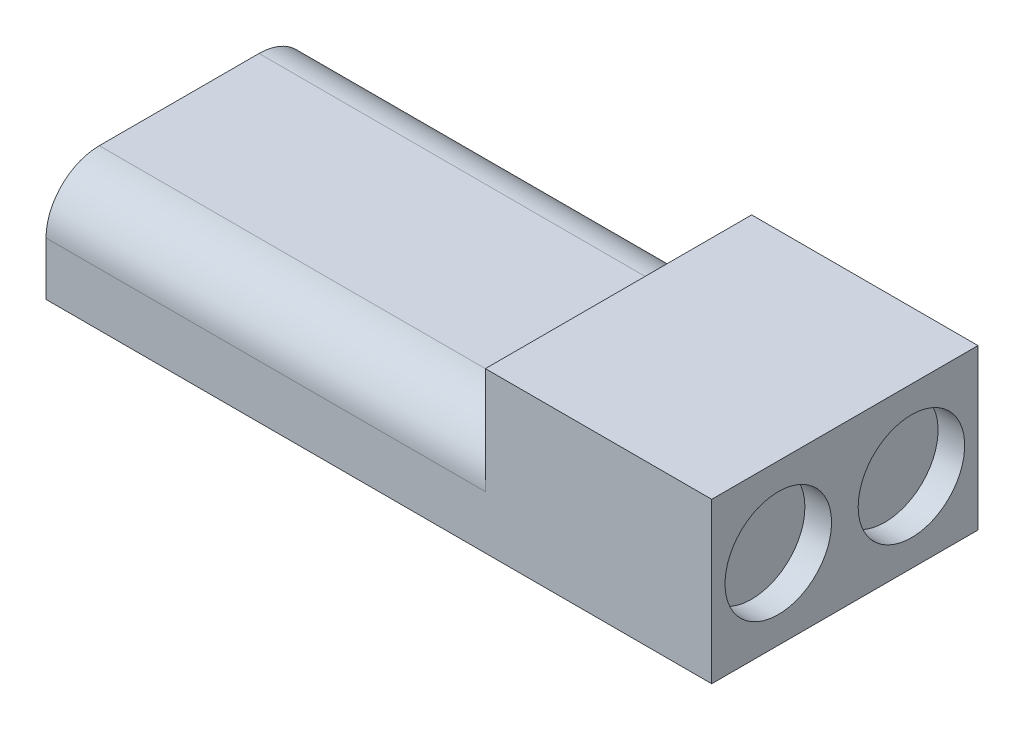
ISO-10303-21;
HEADER;
FILE_DESCRIPTION(('STEP AP214'),'2;1');
FILE_NAME('part.step','',(''),(''),'','','');
FILE_SCHEMA(('AUTOMOTIVE_DESIGN { 1 0 10303 214 1 1 1 1 }'));
ENDSEC;
DATA;
#1=APPLICATION_CONTEXT('core data for automotive mechanical design processes');
#2=APPLICATION_PROTOCOL_DEFINITION('international standard','automotive_design',2000,#1);
#3=PRODUCT_CONTEXT('',#1,'mechanical');
#4=PRODUCT('Part','Part','',(#3));
#5=PRODUCT_RELATED_PRODUCT_CATEGORY('part','',(#4));
#6=PRODUCT_DEFINITION_FORMATION('','',#4);
#7=PRODUCT_DEFINITION_CONTEXT('part definition',#1,'design');
#8=PRODUCT_DEFINITION('design','',#6,#7);
#9=PRODUCT_DEFINITION_SHAPE('','',#8);
#10=(LENGTH_UNIT() NAMED_UNIT(*) SI_UNIT(.MILLI.,.METRE.));
#11=(NAMED_UNIT(*) PLANE_ANGLE_UNIT() SI_UNIT($,.RADIAN.));
#12=(NAMED_UNIT(*) SI_UNIT($,.STERADIAN.) SOLID_ANGLE_UNIT());
#13=UNCERTAINTY_MEASURE_WITH_UNIT(LENGTH_MEASURE(1.E-05),#10,'distance_accuracy_value','');
#14=(GEOMETRIC_REPRESENTATION_CONTEXT(3) GLOBAL_UNCERTAINTY_ASSIGNED_CONTEXT((#13)) GLOBAL_UNIT_ASSIGNED_CONTEXT((#10,
#11,#12)) REPRESENTATION_CONTEXT('',''));
#15=CARTESIAN_POINT('',(0.,0.,0.));
#16=DIRECTION('',(0.,0.,1.));
#17=DIRECTION('',(1.,0.,0.));
#18=AXIS2_PLACEMENT_3D('',#15,#16,#17);
#19=CARTESIAN_POINT('',(-2.08333333333334,2.,5.));
#20=DIRECTION('',(1.,0.,0.));
#21=DIRECTION('',(0.,0.,-1.));
#22=AXIS2_PLACEMENT_3D('',#19,#20,#21);
#23=PLANE('',#22);
#24=DIRECTION('',(0.,0.,-1.));
#25=VECTOR('',#24,1.);
#26=CARTESIAN_POINT('',(-2.08333333333334,0.5,0.));
#27=LINE('',#26,#25);
#28=CARTESIAN_POINT('',(-2.08333333333334,0.499999999999999,4.1777572669829));
#29=VERTEX_POINT('',#28);
#30=CARTESIAN_POINT('',(-2.08333333333334,0.5,3.32224273301709));
#31=VERTEX_POINT('',#30);
#32=EDGE_CURVE('E54',#29,#31,#27,.T.);
#33=ORIENTED_EDGE('',*,*,#32,.T.);
#34=CARTESIAN_POINT('',(-2.08333333333334,0.499999999999999,3.75));
#35=DIRECTION('',(-1.,0.,0.));
#36=DIRECTION('',(0.,0.,1.));
#37=AXIS2_PLACEMENT_3D('',#34,#35,#36);
#38=CIRCLE('',#37,0.427757266982905);
#39=EDGE_CURVE('E143',#29,#31,#38,.T.);
#40=ORIENTED_EDGE('',*,*,#39,.F.);
#41=EDGE_LOOP('',(#33,#40));
#42=FACE_BOUND('',#41,.T.);
#43=DIRECTION('',(0.,0.,-1.));
#44=VECTOR('',#43,1.);
#45=CARTESIAN_POINT('',(-2.08333333333334,2.,5.));
#46=LINE('',#45,#44);
#47=CARTESIAN_POINT('',(-2.08333333333334,2.,4.));
#48=VERTEX_POINT('',#47);
#49=CARTESIAN_POINT('',(-2.08333333333334,2.,1.));
#50=VERTEX_POINT('',#49);
#51=EDGE_CURVE('E193',#48,#50,#46,.T.);
#52=ORIENTED_EDGE('',*,*,#51,.T.);
#53=CARTESIAN_POINT('',(-2.08333333333334,1.,1.));
#54=DIRECTION('',(1.,0.,0.));
#55=DIRECTION('',(0.,0.,-1.));
#56=AXIS2_PLACEMENT_3D('',#53,#54,#55);
#57=CIRCLE('',#56,1.);
#58=CARTESIAN_POINT('',(-2.08333333333334,1.,0.));
#59=VERTEX_POINT('',#58);
#60=EDGE_CURVE('E240',#50,#59,#57,.F.);
#61=ORIENTED_EDGE('',*,*,#60,.T.);
#62=DIRECTION('',(0.,-1.,0.));
#63=VECTOR('',#62,1.);
#64=CARTESIAN_POINT('',(-2.08333333333334,2.,0.));
#65=LINE('',#64,#63);
#66=CARTESIAN_POINT('',(-2.08333333333334,0.,0.));
#67=VERTEX_POINT('',#66);
#68=EDGE_CURVE('E155',#59,#67,#65,.T.);
#69=ORIENTED_EDGE('',*,*,#68,.T.);
#70=DIRECTION('',(0.,0.,-1.));
#71=VECTOR('',#70,1.);
#72=CARTESIAN_POINT('',(-2.08333333333334,0.,5.));
#73=LINE('',#72,#71);
#74=CARTESIAN_POINT('',(-2.08333333333334,0.,5.));
#75=VERTEX_POINT('',#74);
#76=EDGE_CURVE('E226',#75,#67,#73,.T.);
#77=ORIENTED_EDGE('',*,*,#76,.F.);
#78=DIRECTION('',(0.,-1.,0.));
#79=VECTOR('',#78,1.);
#80=CARTESIAN_POINT('',(-2.08333333333334,2.,5.));
#81=LINE('',#80,#79);
#82=CARTESIAN_POINT('',(-2.08333333333334,1.,5.));
#83=VERTEX_POINT('',#82);
#84=EDGE_CURVE('E177',#83,#75,#81,.T.);
#85=ORIENTED_EDGE('',*,*,#84,.F.);
#86=CARTESIAN_POINT('',(-2.08333333333334,1.,4.));
#87=DIRECTION('',(1.,0.,0.));
#88=DIRECTION('',(0.,0.,-1.));
#89=AXIS2_PLACEMENT_3D('',#86,#87,#88);
#90=CIRCLE('',#89,1.);
#91=EDGE_CURVE('E237',#83,#48,#90,.F.);
#92=ORIENTED_EDGE('',*,*,#91,.T.);
#93=EDGE_LOOP('',(#52,#61,#69,#77,#85,#92));
#94=FACE_BOUND('',#93,.T.);
#95=CARTESIAN_POINT('',(-2.08333333333334,0.499999999999999,1.25));
#96=DIRECTION('',(1.,0.,0.));
#97=DIRECTION('',(0.,0.,-1.));
#98=AXIS2_PLACEMENT_3D('',#95,#96,#97);
#99=CIRCLE('',#98,0.427757266982905);
#100=CARTESIAN_POINT('',(-2.08333333333334,0.499999999999999,0.822242733017095));
#101=VERTEX_POINT('',#100);
#102=CARTESIAN_POINT('',(-2.08333333333334,0.5,1.67775726698291));
#103=VERTEX_POINT('',#102);
#104=EDGE_CURVE('E165',#101,#103,#99,.T.);
#105=ORIENTED_EDGE('',*,*,#104,.T.);
#106=DIRECTION('',(0.,0.,1.));
#107=VECTOR('',#106,1.);
#108=CARTESIAN_POINT('',(-2.08333333333334,0.499999999999999,0.822242733017095));
#109=LINE('',#108,#107);
#110=EDGE_CURVE('E62',#101,#103,#109,.T.);
#111=ORIENTED_EDGE('',*,*,#110,.F.);
#112=EDGE_LOOP('',(#105,#111));
#113=FACE_BOUND('',#112,.T.);
#114=ADVANCED_FACE('F38',(#42,#94,#113),#23,.F.);
#115=CARTESIAN_POINT('',(-2.08333333333334,0.,5.));
#116=DIRECTION('',(0.,1.,0.));
#117=DIRECTION('',(0.,0.,1.));
#118=AXIS2_PLACEMENT_3D('',#115,#116,#117);
#119=PLANE('',#118);
#120=DIRECTION('',(1.,0.,0.));
#121=VECTOR('',#120,1.);
#122=CARTESIAN_POINT('',(-2.08333333333334,0.,0.));
#123=LINE('',#122,#121);
#124=CARTESIAN_POINT('',(10.4166666666667,0.,0.));
#125=VERTEX_POINT('',#124);
#126=EDGE_CURVE('E196',#67,#125,#123,.T.);
#127=ORIENTED_EDGE('',*,*,#126,.T.);
#128=DIRECTION('',(0.,0.,-1.));
#129=VECTOR('',#128,1.);
#130=CARTESIAN_POINT('',(10.4166666666667,0.,5.));
#131=LINE('',#130,#129);
#132=CARTESIAN_POINT('',(10.4166666666667,0.,5.));
#133=VERTEX_POINT('',#132);
#134=EDGE_CURVE('E222',#133,#125,#131,.T.);
#135=ORIENTED_EDGE('',*,*,#134,.F.);
#136=DIRECTION('',(1.,0.,0.));
#137=VECTOR('',#136,1.);
#138=CARTESIAN_POINT('',(-2.08333333333334,0.,5.));
#139=LINE('',#138,#137);
#140=EDGE_CURVE('E180',#75,#133,#139,.T.);
#141=ORIENTED_EDGE('',*,*,#140,.F.);
#142=ORIENTED_EDGE('',*,*,#76,.T.);
#143=EDGE_LOOP('',(#127,#135,#141,#142));
#144=FACE_BOUND('',#143,.T.);
#145=ADVANCED_FACE('F277',(#144),#119,.F.);
#146=CARTESIAN_POINT('',(10.4166666666667,3.,5.));
#147=DIRECTION('',(-1.,0.,0.));
#148=DIRECTION('',(0.,0.,1.));
#149=AXIS2_PLACEMENT_3D('',#146,#147,#148);
#150=PLANE('',#149);
#151=CARTESIAN_POINT('',(10.4166666666667,1.5,3.75));
#152=DIRECTION('',(1.,0.,0.));
#153=DIRECTION('',(0.,0.,-1.));
#154=AXIS2_PLACEMENT_3D('',#151,#152,#153);
#155=CIRCLE('',#154,1.);
#156=CARTESIAN_POINT('',(10.4166666666667,1.5,2.75));
#157=VERTEX_POINT('',#156);
#158=EDGE_CURVE('E454',#157,#157,#155,.T.);
#159=ORIENTED_EDGE('',*,*,#158,.F.);
#160=EDGE_LOOP('',(#159));
#161=FACE_BOUND('',#160,.T.);
#162=CARTESIAN_POINT('',(10.4166666666667,1.5,1.25));
#163=DIRECTION('',(1.,0.,0.));
#164=DIRECTION('',(0.,0.,1.));
#165=AXIS2_PLACEMENT_3D('',#162,#163,#164);
#166=CIRCLE('',#165,1.);
#167=CARTESIAN_POINT('',(10.4166666666667,1.5,2.25));
#168=VERTEX_POINT('',#167);
#169=EDGE_CURVE('E463',#168,#168,#166,.T.);
#170=ORIENTED_EDGE('',*,*,#169,.F.);
#171=EDGE_LOOP('',(#170));
#172=FACE_BOUND('',#171,.T.);
#173=DIRECTION('',(0.,1.,0.));
#174=VECTOR('',#173,1.);
#175=CARTESIAN_POINT('',(10.4166666666667,3.,0.));
#176=LINE('',#175,#174);
#177=CARTESIAN_POINT('',(10.4166666666667,3.,0.));
#178=VERTEX_POINT('',#177);
#179=EDGE_CURVE('E199',#125,#178,#176,.T.);
#180=ORIENTED_EDGE('',*,*,#179,.T.);
#181=DIRECTION('',(0.,0.,-1.));
#182=VECTOR('',#181,1.);
#183=CARTESIAN_POINT('',(10.4166666666667,3.,5.));
#184=LINE('',#183,#182);
#185=CARTESIAN_POINT('',(10.4166666666667,3.,5.));
#186=VERTEX_POINT('',#185);
#187=EDGE_CURVE('E218',#186,#178,#184,.T.);
#188=ORIENTED_EDGE('',*,*,#187,.F.);
#189=DIRECTION('',(0.,1.,0.));
#190=VECTOR('',#189,1.);
#191=CARTESIAN_POINT('',(10.4166666666667,3.,5.));
#192=LINE('',#191,#190);
#193=EDGE_CURVE('E184',#133,#186,#192,.T.);
#194=ORIENTED_EDGE('',*,*,#193,.F.);
#195=ORIENTED_EDGE('',*,*,#134,.T.);
#196=EDGE_LOOP('',(#180,#188,#194,#195));
#197=FACE_BOUND('',#196,.T.);
#198=ADVANCED_FACE('F291',(#161,#172,#197),#150,.F.);
#199=CARTESIAN_POINT('',(6.16666666666666,3.,5.));
#200=DIRECTION('',(0.,-1.,0.));
#201=DIRECTION('',(0.,0.,-1.));
#202=AXIS2_PLACEMENT_3D('',#199,#200,#201);
#203=PLANE('',#202);
#204=DIRECTION('',(-1.,0.,0.));
#205=VECTOR('',#204,1.);
#206=CARTESIAN_POINT('',(6.16666666666666,3.,0.));
#207=LINE('',#206,#205);
#208=CARTESIAN_POINT('',(6.16666666666666,3.,0.));
#209=VERTEX_POINT('',#208);
#210=EDGE_CURVE('E202',#178,#209,#207,.T.);
#211=ORIENTED_EDGE('',*,*,#210,.T.);
#212=DIRECTION('',(0.,0.,-1.));
#213=VECTOR('',#212,1.);
#214=CARTESIAN_POINT('',(6.16666666666666,3.,5.));
#215=LINE('',#214,#213);
#216=CARTESIAN_POINT('',(6.16666666666666,3.,5.));
#217=VERTEX_POINT('',#216);
#218=EDGE_CURVE('E214',#217,#209,#215,.T.);
#219=ORIENTED_EDGE('',*,*,#218,.F.);
#220=DIRECTION('',(-1.,0.,0.));
#221=VECTOR('',#220,1.);
#222=CARTESIAN_POINT('',(6.16666666666666,3.,5.));
#223=LINE('',#222,#221);
#224=EDGE_CURVE('E187',#186,#217,#223,.T.);
#225=ORIENTED_EDGE('',*,*,#224,.F.);
#226=ORIENTED_EDGE('',*,*,#187,.T.);
#227=EDGE_LOOP('',(#211,#219,#225,#226));
#228=FACE_BOUND('',#227,.T.);
#229=ADVANCED_FACE('F287',(#228),#203,.F.);
#230=CARTESIAN_POINT('',(6.16666666666666,2.,5.));
#231=DIRECTION('',(1.,0.,0.));
#232=DIRECTION('',(0.,0.,-1.));
#233=AXIS2_PLACEMENT_3D('',#230,#231,#232);
#234=PLANE('',#233);
#235=DIRECTION('',(0.,-1.,0.));
#236=VECTOR('',#235,1.);
#237=CARTESIAN_POINT('',(6.16666666666666,2.,0.));
#238=LINE('',#237,#236);
#239=CARTESIAN_POINT('',(6.16666666666666,1.,0.));
#240=VERTEX_POINT('',#239);
#241=EDGE_CURVE('E181',#209,#240,#238,.T.);
#242=ORIENTED_EDGE('',*,*,#241,.T.);
#243=CARTESIAN_POINT('',(6.16666666666666,1.,1.));
#244=DIRECTION('',(1.,0.,0.));
#245=DIRECTION('',(0.,0.,-1.));
#246=AXIS2_PLACEMENT_3D('',#243,#244,#245);
#247=CIRCLE('',#246,1.);
#248=CARTESIAN_POINT('',(6.16666666666666,2.,1.));
#249=VERTEX_POINT('',#248);
#250=EDGE_CURVE('E47',#240,#249,#247,.T.);
#251=ORIENTED_EDGE('',*,*,#250,.T.);
#252=DIRECTION('',(0.,0.,-1.));
#253=VECTOR('',#252,1.);
#254=CARTESIAN_POINT('',(6.16666666666666,2.,5.));
#255=LINE('',#254,#253);
#256=CARTESIAN_POINT('',(6.16666666666666,2.,4.));
#257=VERTEX_POINT('',#256);
#258=EDGE_CURVE('E210',#257,#249,#255,.T.);
#259=ORIENTED_EDGE('',*,*,#258,.F.);
#260=CARTESIAN_POINT('',(6.16666666666666,1.,4.));
#261=DIRECTION('',(1.,0.,0.));
#262=DIRECTION('',(0.,0.,-1.));
#263=AXIS2_PLACEMENT_3D('',#260,#261,#262);
#264=CIRCLE('',#263,1.);
#265=CARTESIAN_POINT('',(6.16666666666666,1.,5.));
#266=VERTEX_POINT('',#265);
#267=EDGE_CURVE('E11',#257,#266,#264,.T.);
#268=ORIENTED_EDGE('',*,*,#267,.T.);
#269=DIRECTION('',(0.,-1.,0.));
#270=VECTOR('',#269,1.);
#271=CARTESIAN_POINT('',(6.16666666666666,2.,5.));
#272=LINE('',#271,#270);
#273=EDGE_CURVE('E190',#217,#266,#272,.T.);
#274=ORIENTED_EDGE('',*,*,#273,.F.);
#275=ORIENTED_EDGE('',*,*,#218,.T.);
#276=EDGE_LOOP('',(#242,#251,#259,#268,#274,#275));
#277=FACE_BOUND('',#276,.T.);
#278=ADVANCED_FACE('F254',(#277),#234,.F.);
#279=CARTESIAN_POINT('',(-2.08333333333334,2.,5.));
#280=DIRECTION('',(0.,-1.,0.));
#281=DIRECTION('',(0.,0.,-1.));
#282=AXIS2_PLACEMENT_3D('',#279,#280,#281);
#283=PLANE('',#282);
#284=ORIENTED_EDGE('',*,*,#258,.T.);
#285=DIRECTION('',(-1.,0.,0.));
#286=VECTOR('',#285,1.);
#287=CARTESIAN_POINT('',(-2.08333333333334,2.,1.));
#288=LINE('',#287,#286);
#289=EDGE_CURVE('E233',#249,#50,#288,.T.);
#290=ORIENTED_EDGE('',*,*,#289,.T.);
#291=ORIENTED_EDGE('',*,*,#51,.F.);
#292=DIRECTION('',(-1.,0.,0.));
#293=VECTOR('',#292,1.);
#294=CARTESIAN_POINT('',(6.16666666666666,2.,4.));
#295=LINE('',#294,#293);
#296=EDGE_CURVE('E230',#48,#257,#295,.F.);
#297=ORIENTED_EDGE('',*,*,#296,.T.);
#298=EDGE_LOOP('',(#284,#290,#291,#297));
#299=FACE_BOUND('',#298,.T.);
#300=ADVANCED_FACE('F261',(#299),#283,.F.);
#301=CARTESIAN_POINT('',(0.,0.,5.));
#302=DIRECTION('',(0.,0.,1.));
#303=DIRECTION('',(1.,0.,0.));
#304=AXIS2_PLACEMENT_3D('',#301,#302,#303);
#305=PLANE('',#304);
#306=ORIENTED_EDGE('',*,*,#273,.T.);
#307=DIRECTION('',(-1.,0.,0.));
#308=VECTOR('',#307,1.);
#309=CARTESIAN_POINT('',(-2.08333333333334,1.,5.));
#310=LINE('',#309,#308);
#311=EDGE_CURVE('E247',#266,#83,#310,.T.);
#312=ORIENTED_EDGE('',*,*,#311,.T.);
#313=ORIENTED_EDGE('',*,*,#84,.T.);
#314=ORIENTED_EDGE('',*,*,#140,.T.);
#315=ORIENTED_EDGE('',*,*,#193,.T.);
#316=ORIENTED_EDGE('',*,*,#224,.T.);
#317=EDGE_LOOP('',(#306,#312,#313,#314,#315,#316));
#318=FACE_BOUND('',#317,.T.);
#319=ADVANCED_FACE('F280',(#318),#305,.T.);
#320=CARTESIAN_POINT('',(0.,0.,0.));
#321=DIRECTION('',(0.,0.,1.));
#322=DIRECTION('',(1.,0.,0.));
#323=AXIS2_PLACEMENT_3D('',#320,#321,#322);
#324=PLANE('',#323);
#325=ORIENTED_EDGE('',*,*,#68,.F.);
#326=DIRECTION('',(-1.,0.,0.));
#327=VECTOR('',#326,1.);
#328=CARTESIAN_POINT('',(0.,1.,0.));
#329=LINE('',#328,#327);
#330=EDGE_CURVE('E243',#59,#240,#329,.F.);
#331=ORIENTED_EDGE('',*,*,#330,.T.);
#332=ORIENTED_EDGE('',*,*,#241,.F.);
#333=ORIENTED_EDGE('',*,*,#210,.F.);
#334=ORIENTED_EDGE('',*,*,#179,.F.);
#335=ORIENTED_EDGE('',*,*,#126,.F.);
#336=EDGE_LOOP('',(#325,#331,#332,#333,#334,#335));
#337=FACE_BOUND('',#336,.T.);
#338=ADVANCED_FACE('F271',(#337),#324,.F.);
#339=CARTESIAN_POINT('',(-2.08333333333334,1.,1.));
#340=DIRECTION('',(-1.,0.,0.));
#341=DIRECTION('',(0.,0.,1.));
#342=AXIS2_PLACEMENT_3D('',#339,#340,#341);
#343=CYLINDRICAL_SURFACE('',#342,1.);
#344=ORIENTED_EDGE('',*,*,#250,.F.);
#345=ORIENTED_EDGE('',*,*,#330,.F.);
#346=ORIENTED_EDGE('',*,*,#60,.F.);
#347=ORIENTED_EDGE('',*,*,#289,.F.);
#348=EDGE_LOOP('',(#344,#345,#346,#347));
#349=FACE_BOUND('',#348,.T.);
#350=ADVANCED_FACE('F264',(#349),#343,.T.);
#351=CARTESIAN_POINT('',(0.,1.,4.));
#352=DIRECTION('',(1.,0.,0.));
#353=DIRECTION('',(0.,0.,-1.));
#354=AXIS2_PLACEMENT_3D('',#351,#352,#353);
#355=CYLINDRICAL_SURFACE('',#354,1.);
#356=ORIENTED_EDGE('',*,*,#267,.F.);
#357=ORIENTED_EDGE('',*,*,#296,.F.);
#358=ORIENTED_EDGE('',*,*,#91,.F.);
#359=ORIENTED_EDGE('',*,*,#311,.F.);
#360=EDGE_LOOP('',(#356,#357,#358,#359));
#361=FACE_BOUND('',#360,.T.);
#362=ADVANCED_FACE('F40',(#361),#355,.T.);
#363=CARTESIAN_POINT('',(7.91666666666666,0.499999999999999,0.822242733017095));
#364=DIRECTION('',(0.,-1.,0.));
#365=DIRECTION('',(0.,0.,-1.));
#366=AXIS2_PLACEMENT_3D('',#363,#364,#365);
#367=PLANE('',#366);
#368=ORIENTED_EDGE('',*,*,#110,.T.);
#369=DIRECTION('',(-1.,0.,0.));
#370=VECTOR('',#369,1.);
#371=CARTESIAN_POINT('',(7.91666666666666,0.5,1.67775726698291));
#372=LINE('',#371,#370);
#373=CARTESIAN_POINT('',(7.91666666666666,0.5,1.67775726698291));
#374=VERTEX_POINT('',#373);
#375=EDGE_CURVE('E157',#374,#103,#372,.T.);
#376=ORIENTED_EDGE('',*,*,#375,.F.);
#377=DIRECTION('',(0.,0.,1.));
#378=VECTOR('',#377,1.);
#379=CARTESIAN_POINT('',(7.91666666666666,0.499999999999999,0.822242733017095));
#380=LINE('',#379,#378);
#381=CARTESIAN_POINT('',(7.91666666666666,0.499999999999999,0.822242733017095));
#382=VERTEX_POINT('',#381);
#383=EDGE_CURVE('E169',#382,#374,#380,.T.);
#384=ORIENTED_EDGE('',*,*,#383,.F.);
#385=DIRECTION('',(-1.,0.,0.));
#386=VECTOR('',#385,1.);
#387=CARTESIAN_POINT('',(7.91666666666666,0.499999999999999,0.822242733017095));
#388=LINE('',#387,#386);
#389=EDGE_CURVE('E161',#382,#101,#388,.T.);
#390=ORIENTED_EDGE('',*,*,#389,.T.);
#391=EDGE_LOOP('',(#368,#376,#384,#390));
#392=FACE_BOUND('',#391,.T.);
#393=ADVANCED_FACE('F317',(#392),#367,.F.);
#394=CARTESIAN_POINT('',(7.91666666666666,0.499999999999999,1.25));
#395=DIRECTION('',(-1.,0.,0.));
#396=DIRECTION('',(0.,0.,1.));
#397=AXIS2_PLACEMENT_3D('',#394,#395,#396);
#398=CYLINDRICAL_SURFACE('',#397,0.427757266982905);
#399=ORIENTED_EDGE('',*,*,#104,.F.);
#400=ORIENTED_EDGE('',*,*,#389,.F.);
#401=CARTESIAN_POINT('',(7.91666666666666,0.499999999999999,1.25));
#402=DIRECTION('',(1.,0.,0.));
#403=DIRECTION('',(0.,0.,-1.));
#404=AXIS2_PLACEMENT_3D('',#401,#402,#403);
#405=CIRCLE('',#404,0.427757266982905);
#406=EDGE_CURVE('E160',#382,#374,#405,.T.);
#407=ORIENTED_EDGE('',*,*,#406,.T.);
#408=ORIENTED_EDGE('',*,*,#375,.T.);
#409=EDGE_LOOP('',(#399,#400,#407,#408));
#410=FACE_BOUND('',#409,.T.);
#411=ADVANCED_FACE('F363',(#410),#398,.F.);
#412=CARTESIAN_POINT('',(7.91666666666666,0.499999999999999,1.25));
#413=DIRECTION('',(1.,0.,0.));
#414=DIRECTION('',(0.,0.,-1.));
#415=AXIS2_PLACEMENT_3D('',#412,#413,#414);
#416=PLANE('',#415);
#417=ORIENTED_EDGE('',*,*,#383,.T.);
#418=ORIENTED_EDGE('',*,*,#406,.F.);
#419=EDGE_LOOP('',(#417,#418));
#420=FACE_BOUND('',#419,.T.);
#421=ADVANCED_FACE('F371',(#420),#416,.F.);
#422=CARTESIAN_POINT('',(7.91666666666666,0.5,0.));
#423=DIRECTION('',(0.,1.,0.));
#424=DIRECTION('',(0.,0.,1.));
#425=AXIS2_PLACEMENT_3D('',#422,#423,#424);
#426=PLANE('',#425);
#427=ORIENTED_EDGE('',*,*,#32,.F.);
#428=DIRECTION('',(-1.,0.,0.));
#429=VECTOR('',#428,1.);
#430=CARTESIAN_POINT('',(7.91666666666666,0.499999999999999,4.1777572669829));
#431=LINE('',#430,#429);
#432=CARTESIAN_POINT('',(7.91666666666666,0.499999999999999,4.1777572669829));
#433=VERTEX_POINT('',#432);
#434=EDGE_CURVE('E126',#433,#29,#431,.T.);
#435=ORIENTED_EDGE('',*,*,#434,.F.);
#436=DIRECTION('',(0.,0.,-1.));
#437=VECTOR('',#436,1.);
#438=CARTESIAN_POINT('',(7.91666666666666,0.5,0.));
#439=LINE('',#438,#437);
#440=CARTESIAN_POINT('',(7.91666666666666,0.5,3.32224273301709));
#441=VERTEX_POINT('',#440);
#442=EDGE_CURVE('E129',#433,#441,#439,.T.);
#443=ORIENTED_EDGE('',*,*,#442,.T.);
#444=DIRECTION('',(-1.,0.,0.));
#445=VECTOR('',#444,1.);
#446=CARTESIAN_POINT('',(7.91666666666666,0.5,3.32224273301709));
#447=LINE('',#446,#445);
#448=EDGE_CURVE('E136',#441,#31,#447,.T.);
#449=ORIENTED_EDGE('',*,*,#448,.T.);
#450=EDGE_LOOP('',(#427,#435,#443,#449));
#451=FACE_BOUND('',#450,.T.);
#452=ADVANCED_FACE('F128',(#451),#426,.T.);
#453=CARTESIAN_POINT('',(7.91666666666666,0.499999999999999,3.75));
#454=DIRECTION('',(-1.,0.,0.));
#455=DIRECTION('',(0.,0.,1.));
#456=AXIS2_PLACEMENT_3D('',#453,#454,#455);
#457=CYLINDRICAL_SURFACE('',#456,0.427757266982905);
#458=ORIENTED_EDGE('',*,*,#39,.T.);
#459=ORIENTED_EDGE('',*,*,#448,.F.);
#460=CARTESIAN_POINT('',(7.91666666666666,0.499999999999999,3.75));
#461=DIRECTION('',(-1.,0.,0.));
#462=DIRECTION('',(0.,0.,1.));
#463=AXIS2_PLACEMENT_3D('',#460,#461,#462);
#464=CIRCLE('',#463,0.427757266982905);
#465=EDGE_CURVE('E137',#433,#441,#464,.T.);
#466=ORIENTED_EDGE('',*,*,#465,.F.);
#467=ORIENTED_EDGE('',*,*,#434,.T.);
#468=EDGE_LOOP('',(#458,#459,#466,#467));
#469=FACE_BOUND('',#468,.T.);
#470=ADVANCED_FACE('F145',(#469),#457,.F.);
#471=CARTESIAN_POINT('',(7.91666666666666,0.,0.));
#472=DIRECTION('',(-1.,0.,0.));
#473=DIRECTION('',(0.,0.,1.));
#474=AXIS2_PLACEMENT_3D('',#471,#472,#473);
#475=PLANE('',#474);
#476=ORIENTED_EDGE('',*,*,#442,.F.);
#477=ORIENTED_EDGE('',*,*,#465,.T.);
#478=EDGE_LOOP('',(#476,#477));
#479=FACE_BOUND('',#478,.T.);
#480=ADVANCED_FACE('F141',(#479),#475,.T.);
#481=CARTESIAN_POINT('',(9.91666666666666,1.5,1.25));
#482=DIRECTION('',(1.,0.,0.));
#483=DIRECTION('',(0.,0.,-1.));
#484=AXIS2_PLACEMENT_3D('',#481,#482,#483);
#485=CYLINDRICAL_SURFACE('',#484,1.);
#486=CARTESIAN_POINT('',(9.91666666666666,1.5,1.25));
#487=DIRECTION('',(1.,0.,0.));
#488=DIRECTION('',(0.,0.,1.));
#489=AXIS2_PLACEMENT_3D('',#486,#487,#488);
#490=CIRCLE('',#489,1.);
#491=CARTESIAN_POINT('',(9.91666666666666,1.5,2.25));
#492=VERTEX_POINT('',#491);
#493=EDGE_CURVE('E458',#492,#492,#490,.T.);
#494=ORIENTED_EDGE('',*,*,#493,.F.);
#495=EDGE_LOOP('',(#494));
#496=FACE_BOUND('',#495,.T.);
#497=ORIENTED_EDGE('',*,*,#169,.T.);
#498=EDGE_LOOP('',(#497));
#499=FACE_BOUND('',#498,.T.);
#500=ADVANCED_FACE('F400',(#496,#499),#485,.F.);
#501=CARTESIAN_POINT('',(9.91666666666666,1.5,1.25));
#502=DIRECTION('',(-1.,0.,0.));
#503=DIRECTION('',(0.,0.,1.));
#504=AXIS2_PLACEMENT_3D('',#501,#502,#503);
#505=PLANE('',#504);
#506=ORIENTED_EDGE('',*,*,#493,.T.);
#507=EDGE_LOOP('',(#506));
#508=FACE_BOUND('',#507,.T.);
#509=ADVANCED_FACE('F407',(#508),#505,.F.);
#510=CARTESIAN_POINT('',(9.91666666666666,1.5,3.75));
#511=DIRECTION('',(1.,0.,0.));
#512=DIRECTION('',(0.,0.,-1.));
#513=AXIS2_PLACEMENT_3D('',#510,#511,#512);
#514=CYLINDRICAL_SURFACE('',#513,1.);
#515=CARTESIAN_POINT('',(9.91666666666666,1.5,3.75));
#516=DIRECTION('',(1.,0.,0.));
#517=DIRECTION('',(0.,0.,-1.));
#518=AXIS2_PLACEMENT_3D('',#515,#516,#517);
#519=CIRCLE('',#518,1.);
#520=CARTESIAN_POINT('',(9.91666666666666,1.5,2.75));
#521=VERTEX_POINT('',#520);
#522=EDGE_CURVE('E164',#521,#521,#519,.T.);
#523=ORIENTED_EDGE('',*,*,#522,.F.);
#524=EDGE_LOOP('',(#523));
#525=FACE_BOUND('',#524,.T.);
#526=ORIENTED_EDGE('',*,*,#158,.T.);
#527=EDGE_LOOP('',(#526));
#528=FACE_BOUND('',#527,.T.);
#529=ADVANCED_FACE('F416',(#525,#528),#514,.F.);
#530=CARTESIAN_POINT('',(9.91666666666666,1.5,3.75));
#531=DIRECTION('',(1.,0.,0.));
#532=DIRECTION('',(0.,0.,-1.));
#533=AXIS2_PLACEMENT_3D('',#530,#531,#532);
#534=PLANE('',#533);
#535=ORIENTED_EDGE('',*,*,#522,.T.);
#536=EDGE_LOOP('',(#535));
#537=FACE_BOUND('',#536,.T.);
#538=ADVANCED_FACE('F425',(#537),#534,.T.);
#539=CLOSED_SHELL('',(#114,#145,#198,#229,#278,#300,#319,#338,#350,#362,#393,#411,#421,#452,
#470,#480,#500,#509,#529,#538));
#540=MANIFOLD_SOLID_BREP('B2',#539);
#541=ADVANCED_BREP_SHAPE_REPRESENTATION('',(#18,#540),#14);
#542=SHAPE_DEFINITION_REPRESENTATION(#9,#541);
ENDSEC;
END-ISO-10303-21;
